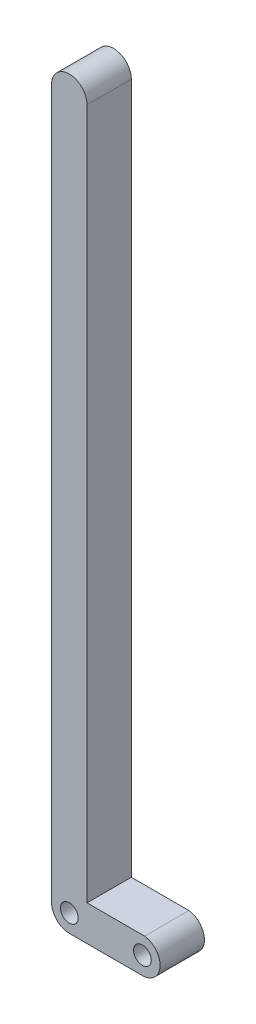
ISO-10303-21;
HEADER;
FILE_DESCRIPTION(('STEP AP214'),'2;1');
FILE_NAME('part.step','',(''),(''),'','','');
FILE_SCHEMA(('AUTOMOTIVE_DESIGN { 1 0 10303 214 1 1 1 1 }'));
ENDSEC;
DATA;
#1=APPLICATION_CONTEXT('core data for automotive mechanical design processes');
#2=APPLICATION_PROTOCOL_DEFINITION('international standard','automotive_design',2000,#1);
#3=PRODUCT_CONTEXT('',#1,'mechanical');
#4=PRODUCT('Part','Part','',(#3));
#5=PRODUCT_RELATED_PRODUCT_CATEGORY('part','',(#4));
#6=PRODUCT_DEFINITION_FORMATION('','',#4);
#7=PRODUCT_DEFINITION_CONTEXT('part definition',#1,'design');
#8=PRODUCT_DEFINITION('design','',#6,#7);
#9=PRODUCT_DEFINITION_SHAPE('','',#8);
#10=(LENGTH_UNIT() NAMED_UNIT(*) SI_UNIT(.MILLI.,.METRE.));
#11=(NAMED_UNIT(*) PLANE_ANGLE_UNIT() SI_UNIT($,.RADIAN.));
#12=(NAMED_UNIT(*) SI_UNIT($,.STERADIAN.) SOLID_ANGLE_UNIT());
#13=UNCERTAINTY_MEASURE_WITH_UNIT(LENGTH_MEASURE(1.E-05),#10,'distance_accuracy_value','');
#14=(GEOMETRIC_REPRESENTATION_CONTEXT(3) GLOBAL_UNCERTAINTY_ASSIGNED_CONTEXT((#13)) GLOBAL_UNIT_ASSIGNED_CONTEXT((#10,
#11,#12)) REPRESENTATION_CONTEXT('',''));
#15=CARTESIAN_POINT('',(0.,0.,0.));
#16=DIRECTION('',(0.,0.,1.));
#17=DIRECTION('',(1.,0.,0.));
#18=AXIS2_PLACEMENT_3D('',#15,#16,#17);
#19=CARTESIAN_POINT('',(0.,80.,5.));
#20=DIRECTION('',(0.,0.,1.));
#21=DIRECTION('',(1.,0.,0.));
#22=AXIS2_PLACEMENT_3D('',#19,#20,#21);
#23=PLANE('',#22);
#24=CARTESIAN_POINT('',(0.,0.,5.));
#25=DIRECTION('',(0.,0.,1.));
#26=DIRECTION('',(1.,0.,0.));
#27=AXIS2_PLACEMENT_3D('',#24,#25,#26);
#28=CIRCLE('',#27,1.);
#29=CARTESIAN_POINT('',(1.,0.,5.));
#30=VERTEX_POINT('',#29);
#31=EDGE_CURVE('E140',#30,#30,#28,.T.);
#32=ORIENTED_EDGE('',*,*,#31,.F.);
#33=EDGE_LOOP('',(#32));
#34=FACE_BOUND('',#33,.T.);
#35=CARTESIAN_POINT('',(0.,80.,5.));
#36=DIRECTION('',(0.,0.,1.));
#37=DIRECTION('',(1.,0.,0.));
#38=AXIS2_PLACEMENT_3D('',#35,#36,#37);
#39=CIRCLE('',#38,2.);
#40=CARTESIAN_POINT('',(1.99993854306078,79.9843212251782,5.));
#41=VERTEX_POINT('',#40);
#42=CARTESIAN_POINT('',(-2.,80.,5.));
#43=VERTEX_POINT('',#42);
#44=EDGE_CURVE('E155',#41,#43,#39,.T.);
#45=ORIENTED_EDGE('',*,*,#44,.T.);
#46=DIRECTION('',(0.,-1.,0.));
#47=VECTOR('',#46,1.);
#48=CARTESIAN_POINT('',(-2.,80.,5.));
#49=LINE('',#48,#47);
#50=CARTESIAN_POINT('',(-1.99999999999973,0.,5.));
#51=VERTEX_POINT('',#50);
#52=EDGE_CURVE('E97',#43,#51,#49,.T.);
#53=ORIENTED_EDGE('',*,*,#52,.T.);
#54=CARTESIAN_POINT('',(0.,0.,5.));
#55=DIRECTION('',(0.,0.,1.));
#56=DIRECTION('',(1.,0.,0.));
#57=AXIS2_PLACEMENT_3D('',#54,#55,#56);
#58=CIRCLE('',#57,1.99999999999986);
#59=CARTESIAN_POINT('',(0.,-1.99999999999986,5.));
#60=VERTEX_POINT('',#59);
#61=EDGE_CURVE('E172',#51,#60,#58,.T.);
#62=ORIENTED_EDGE('',*,*,#61,.T.);
#63=DIRECTION('',(1.,0.,0.));
#64=VECTOR('',#63,1.);
#65=CARTESIAN_POINT('',(0.,-2.,5.));
#66=LINE('',#65,#64);
#67=CARTESIAN_POINT('',(8.25,-2.,5.));
#68=VERTEX_POINT('',#67);
#69=EDGE_CURVE('E113',#60,#68,#66,.T.);
#70=ORIENTED_EDGE('',*,*,#69,.T.);
#71=CARTESIAN_POINT('',(8.25,0.,5.));
#72=DIRECTION('',(0.,0.,1.));
#73=DIRECTION('',(1.,0.,0.));
#74=AXIS2_PLACEMENT_3D('',#71,#72,#73);
#75=CIRCLE('',#74,2.);
#76=CARTESIAN_POINT('',(8.49993854306078,1.98432122517818,5.));
#77=VERTEX_POINT('',#76);
#78=EDGE_CURVE('E107',#68,#77,#75,.T.);
#79=ORIENTED_EDGE('',*,*,#78,.T.);
#80=DIRECTION('',(-1.,0.,0.));
#81=VECTOR('',#80,1.);
#82=CARTESIAN_POINT('',(1.99993854306078,1.98432122517818,5.));
#83=LINE('',#82,#81);
#84=CARTESIAN_POINT('',(1.99993854306078,1.98432122517818,5.));
#85=VERTEX_POINT('',#84);
#86=EDGE_CURVE('E111',#77,#85,#83,.T.);
#87=ORIENTED_EDGE('',*,*,#86,.T.);
#88=DIRECTION('',(0.,1.,0.));
#89=VECTOR('',#88,1.);
#90=CARTESIAN_POINT('',(1.99993854306078,1.98432122517818,5.));
#91=LINE('',#90,#89);
#92=EDGE_CURVE('E57',#85,#41,#91,.T.);
#93=ORIENTED_EDGE('',*,*,#92,.T.);
#94=EDGE_LOOP('',(#45,#53,#62,#70,#79,#87,#93));
#95=FACE_BOUND('',#94,.T.);
#96=CARTESIAN_POINT('',(8.25,0.,5.));
#97=DIRECTION('',(0.,0.,1.));
#98=DIRECTION('',(1.,0.,0.));
#99=AXIS2_PLACEMENT_3D('',#96,#97,#98);
#100=CIRCLE('',#99,1.);
#101=CARTESIAN_POINT('',(9.25,0.,5.));
#102=VERTEX_POINT('',#101);
#103=EDGE_CURVE('E192',#102,#102,#100,.T.);
#104=ORIENTED_EDGE('',*,*,#103,.F.);
#105=EDGE_LOOP('',(#104));
#106=FACE_BOUND('',#105,.T.);
#107=ADVANCED_FACE('F39',(#34,#95,#106),#23,.T.);
#108=CARTESIAN_POINT('',(0.,80.,0.));
#109=DIRECTION('',(0.,0.,1.));
#110=DIRECTION('',(1.,0.,0.));
#111=AXIS2_PLACEMENT_3D('',#108,#109,#110);
#112=PLANE('',#111);
#113=CARTESIAN_POINT('',(0.,80.,0.));
#114=DIRECTION('',(0.,0.,1.));
#115=DIRECTION('',(1.,0.,0.));
#116=AXIS2_PLACEMENT_3D('',#113,#114,#115);
#117=CIRCLE('',#116,2.);
#118=CARTESIAN_POINT('',(1.99993854306078,79.9843212251782,0.));
#119=VERTEX_POINT('',#118);
#120=CARTESIAN_POINT('',(-2.,80.,0.));
#121=VERTEX_POINT('',#120);
#122=EDGE_CURVE('E135',#119,#121,#117,.T.);
#123=ORIENTED_EDGE('',*,*,#122,.F.);
#124=DIRECTION('',(0.,1.,0.));
#125=VECTOR('',#124,1.);
#126=CARTESIAN_POINT('',(1.99993854306078,1.98432122517818,0.));
#127=LINE('',#126,#125);
#128=CARTESIAN_POINT('',(1.99993854306078,1.98432122517818,0.));
#129=VERTEX_POINT('',#128);
#130=EDGE_CURVE('E89',#129,#119,#127,.T.);
#131=ORIENTED_EDGE('',*,*,#130,.F.);
#132=DIRECTION('',(-1.,0.,0.));
#133=VECTOR('',#132,1.);
#134=CARTESIAN_POINT('',(1.99993854306078,1.98432122517818,0.));
#135=LINE('',#134,#133);
#136=CARTESIAN_POINT('',(8.49993854306078,1.98432122517818,0.));
#137=VERTEX_POINT('',#136);
#138=EDGE_CURVE('E83',#137,#129,#135,.T.);
#139=ORIENTED_EDGE('',*,*,#138,.F.);
#140=CARTESIAN_POINT('',(8.25,0.,0.));
#141=DIRECTION('',(0.,0.,1.));
#142=DIRECTION('',(1.,0.,0.));
#143=AXIS2_PLACEMENT_3D('',#140,#141,#142);
#144=CIRCLE('',#143,2.);
#145=CARTESIAN_POINT('',(8.25,-2.,0.));
#146=VERTEX_POINT('',#145);
#147=EDGE_CURVE('E122',#146,#137,#144,.T.);
#148=ORIENTED_EDGE('',*,*,#147,.F.);
#149=DIRECTION('',(1.,0.,0.));
#150=VECTOR('',#149,1.);
#151=CARTESIAN_POINT('',(0.,-2.,0.));
#152=LINE('',#151,#150);
#153=CARTESIAN_POINT('',(0.,-1.99999999999986,0.));
#154=VERTEX_POINT('',#153);
#155=EDGE_CURVE('E146',#154,#146,#152,.T.);
#156=ORIENTED_EDGE('',*,*,#155,.F.);
#157=CARTESIAN_POINT('',(0.,0.,0.));
#158=DIRECTION('',(0.,0.,1.));
#159=DIRECTION('',(1.,0.,0.));
#160=AXIS2_PLACEMENT_3D('',#157,#158,#159);
#161=CIRCLE('',#160,1.99999999999986);
#162=CARTESIAN_POINT('',(-1.99999999999973,0.,0.));
#163=VERTEX_POINT('',#162);
#164=EDGE_CURVE('E143',#163,#154,#161,.T.);
#165=ORIENTED_EDGE('',*,*,#164,.F.);
#166=DIRECTION('',(0.,-1.,0.));
#167=VECTOR('',#166,1.);
#168=CARTESIAN_POINT('',(-2.,80.,0.));
#169=LINE('',#168,#167);
#170=EDGE_CURVE('E139',#121,#163,#169,.T.);
#171=ORIENTED_EDGE('',*,*,#170,.F.);
#172=EDGE_LOOP('',(#123,#131,#139,#148,#156,#165,#171));
#173=FACE_BOUND('',#172,.T.);
#174=CARTESIAN_POINT('',(0.,0.,0.));
#175=DIRECTION('',(0.,0.,1.));
#176=DIRECTION('',(1.,0.,0.));
#177=AXIS2_PLACEMENT_3D('',#174,#175,#176);
#178=CIRCLE('',#177,1.);
#179=CARTESIAN_POINT('',(1.,0.,0.));
#180=VERTEX_POINT('',#179);
#181=EDGE_CURVE('E188',#180,#180,#178,.T.);
#182=ORIENTED_EDGE('',*,*,#181,.T.);
#183=EDGE_LOOP('',(#182));
#184=FACE_BOUND('',#183,.T.);
#185=CARTESIAN_POINT('',(8.25,0.,0.));
#186=DIRECTION('',(0.,0.,1.));
#187=DIRECTION('',(1.,0.,0.));
#188=AXIS2_PLACEMENT_3D('',#185,#186,#187);
#189=CIRCLE('',#188,1.);
#190=CARTESIAN_POINT('',(9.25,0.,0.));
#191=VERTEX_POINT('',#190);
#192=EDGE_CURVE('E196',#191,#191,#189,.T.);
#193=ORIENTED_EDGE('',*,*,#192,.T.);
#194=EDGE_LOOP('',(#193));
#195=FACE_BOUND('',#194,.T.);
#196=ADVANCED_FACE('F176',(#173,#184,#195),#112,.F.);
#197=CARTESIAN_POINT('',(0.,80.,5.));
#198=DIRECTION('',(0.,0.,-1.));
#199=DIRECTION('',(-1.,0.,0.));
#200=AXIS2_PLACEMENT_3D('',#197,#198,#199);
#201=CYLINDRICAL_SURFACE('',#200,2.);
#202=ORIENTED_EDGE('',*,*,#122,.T.);
#203=DIRECTION('',(0.,0.,-1.));
#204=VECTOR('',#203,1.);
#205=CARTESIAN_POINT('',(-2.,80.,5.));
#206=LINE('',#205,#204);
#207=EDGE_CURVE('E11',#43,#121,#206,.T.);
#208=ORIENTED_EDGE('',*,*,#207,.F.);
#209=ORIENTED_EDGE('',*,*,#44,.F.);
#210=DIRECTION('',(0.,0.,-1.));
#211=VECTOR('',#210,1.);
#212=CARTESIAN_POINT('',(1.99993854306078,79.9843212251782,5.));
#213=LINE('',#212,#211);
#214=EDGE_CURVE('E131',#41,#119,#213,.T.);
#215=ORIENTED_EDGE('',*,*,#214,.T.);
#216=EDGE_LOOP('',(#202,#208,#209,#215));
#217=FACE_BOUND('',#216,.T.);
#218=ADVANCED_FACE('F41',(#217),#201,.T.);
#219=CARTESIAN_POINT('',(-2.,80.,5.));
#220=DIRECTION('',(1.,0.,0.));
#221=DIRECTION('',(0.,1.,0.));
#222=AXIS2_PLACEMENT_3D('',#219,#220,#221);
#223=PLANE('',#222);
#224=ORIENTED_EDGE('',*,*,#170,.T.);
#225=DIRECTION('',(0.,0.,-1.));
#226=VECTOR('',#225,1.);
#227=CARTESIAN_POINT('',(-1.99999999999973,0.,5.));
#228=LINE('',#227,#226);
#229=EDGE_CURVE('E49',#51,#163,#228,.T.);
#230=ORIENTED_EDGE('',*,*,#229,.F.);
#231=ORIENTED_EDGE('',*,*,#52,.F.);
#232=ORIENTED_EDGE('',*,*,#207,.T.);
#233=EDGE_LOOP('',(#224,#230,#231,#232));
#234=FACE_BOUND('',#233,.T.);
#235=ADVANCED_FACE('F228',(#234),#223,.F.);
#236=CARTESIAN_POINT('',(0.,0.,5.));
#237=DIRECTION('',(0.,0.,-1.));
#238=DIRECTION('',(-1.,0.,0.));
#239=AXIS2_PLACEMENT_3D('',#236,#237,#238);
#240=CYLINDRICAL_SURFACE('',#239,1.99999999999986);
#241=ORIENTED_EDGE('',*,*,#164,.T.);
#242=DIRECTION('',(0.,0.,-1.));
#243=VECTOR('',#242,1.);
#244=CARTESIAN_POINT('',(0.,-1.99999999999986,5.));
#245=LINE('',#244,#243);
#246=EDGE_CURVE('E162',#60,#154,#245,.T.);
#247=ORIENTED_EDGE('',*,*,#246,.F.);
#248=ORIENTED_EDGE('',*,*,#61,.F.);
#249=ORIENTED_EDGE('',*,*,#229,.T.);
#250=EDGE_LOOP('',(#241,#247,#248,#249));
#251=FACE_BOUND('',#250,.T.);
#252=ADVANCED_FACE('F170',(#251),#240,.T.);
#253=CARTESIAN_POINT('',(0.,-2.,5.));
#254=DIRECTION('',(0.,1.,0.));
#255=DIRECTION('',(0.,0.,1.));
#256=AXIS2_PLACEMENT_3D('',#253,#254,#255);
#257=PLANE('',#256);
#258=ORIENTED_EDGE('',*,*,#155,.T.);
#259=DIRECTION('',(0.,0.,-1.));
#260=VECTOR('',#259,1.);
#261=CARTESIAN_POINT('',(8.25,-2.,5.));
#262=LINE('',#261,#260);
#263=EDGE_CURVE('E124',#68,#146,#262,.T.);
#264=ORIENTED_EDGE('',*,*,#263,.F.);
#265=ORIENTED_EDGE('',*,*,#69,.F.);
#266=ORIENTED_EDGE('',*,*,#246,.T.);
#267=EDGE_LOOP('',(#258,#264,#265,#266));
#268=FACE_BOUND('',#267,.T.);
#269=ADVANCED_FACE('F179',(#268),#257,.F.);
#270=CARTESIAN_POINT('',(8.25,0.,5.));
#271=DIRECTION('',(0.,0.,-1.));
#272=DIRECTION('',(-1.,0.,0.));
#273=AXIS2_PLACEMENT_3D('',#270,#271,#272);
#274=CYLINDRICAL_SURFACE('',#273,2.);
#275=ORIENTED_EDGE('',*,*,#147,.T.);
#276=DIRECTION('',(0.,0.,-1.));
#277=VECTOR('',#276,1.);
#278=CARTESIAN_POINT('',(8.49993854306078,1.98432122517818,5.));
#279=LINE('',#278,#277);
#280=EDGE_CURVE('E119',#77,#137,#279,.T.);
#281=ORIENTED_EDGE('',*,*,#280,.F.);
#282=ORIENTED_EDGE('',*,*,#78,.F.);
#283=ORIENTED_EDGE('',*,*,#263,.T.);
#284=EDGE_LOOP('',(#275,#281,#282,#283));
#285=FACE_BOUND('',#284,.T.);
#286=ADVANCED_FACE('F120',(#285),#274,.T.);
#287=CARTESIAN_POINT('',(1.99993854306078,1.98432122517818,5.));
#288=DIRECTION('',(0.,-1.,0.));
#289=DIRECTION('',(0.,0.,-1.));
#290=AXIS2_PLACEMENT_3D('',#287,#288,#289);
#291=PLANE('',#290);
#292=ORIENTED_EDGE('',*,*,#138,.T.);
#293=DIRECTION('',(0.,0.,-1.));
#294=VECTOR('',#293,1.);
#295=CARTESIAN_POINT('',(1.99993854306078,1.98432122517818,5.));
#296=LINE('',#295,#294);
#297=EDGE_CURVE('E125',#85,#129,#296,.T.);
#298=ORIENTED_EDGE('',*,*,#297,.F.);
#299=ORIENTED_EDGE('',*,*,#86,.F.);
#300=ORIENTED_EDGE('',*,*,#280,.T.);
#301=EDGE_LOOP('',(#292,#298,#299,#300));
#302=FACE_BOUND('',#301,.T.);
#303=ADVANCED_FACE('F127',(#302),#291,.F.);
#304=CARTESIAN_POINT('',(1.99993854306078,1.98432122517818,5.));
#305=DIRECTION('',(-1.,0.,0.));
#306=DIRECTION('',(0.,0.,1.));
#307=AXIS2_PLACEMENT_3D('',#304,#305,#306);
#308=PLANE('',#307);
#309=ORIENTED_EDGE('',*,*,#130,.T.);
#310=ORIENTED_EDGE('',*,*,#214,.F.);
#311=ORIENTED_EDGE('',*,*,#92,.F.);
#312=ORIENTED_EDGE('',*,*,#297,.T.);
#313=EDGE_LOOP('',(#309,#310,#311,#312));
#314=FACE_BOUND('',#313,.T.);
#315=ADVANCED_FACE('F218',(#314),#308,.F.);
#316=CARTESIAN_POINT('',(0.,0.,5.));
#317=DIRECTION('',(0.,0.,-1.));
#318=DIRECTION('',(-1.,0.,0.));
#319=AXIS2_PLACEMENT_3D('',#316,#317,#318);
#320=CYLINDRICAL_SURFACE('',#319,1.);
#321=ORIENTED_EDGE('',*,*,#31,.T.);
#322=EDGE_LOOP('',(#321));
#323=FACE_BOUND('',#322,.T.);
#324=ORIENTED_EDGE('',*,*,#181,.F.);
#325=EDGE_LOOP('',(#324));
#326=FACE_BOUND('',#325,.T.);
#327=ADVANCED_FACE('F215',(#323,#326),#320,.F.);
#328=CARTESIAN_POINT('',(8.25,0.,5.));
#329=DIRECTION('',(0.,0.,-1.));
#330=DIRECTION('',(-1.,0.,0.));
#331=AXIS2_PLACEMENT_3D('',#328,#329,#330);
#332=CYLINDRICAL_SURFACE('',#331,1.);
#333=ORIENTED_EDGE('',*,*,#103,.T.);
#334=EDGE_LOOP('',(#333));
#335=FACE_BOUND('',#334,.T.);
#336=ORIENTED_EDGE('',*,*,#192,.F.);
#337=EDGE_LOOP('',(#336));
#338=FACE_BOUND('',#337,.T.);
#339=ADVANCED_FACE('F204',(#335,#338),#332,.F.);
#340=CLOSED_SHELL('',(#107,#196,#218,#235,#252,#269,#286,#303,#315,#327,#339));
#341=MANIFOLD_SOLID_BREP('B2',#340);
#342=ADVANCED_BREP_SHAPE_REPRESENTATION('',(#18,#341),#14);
#343=SHAPE_DEFINITION_REPRESENTATION(#9,#342);
ENDSEC;
END-ISO-10303-21;
